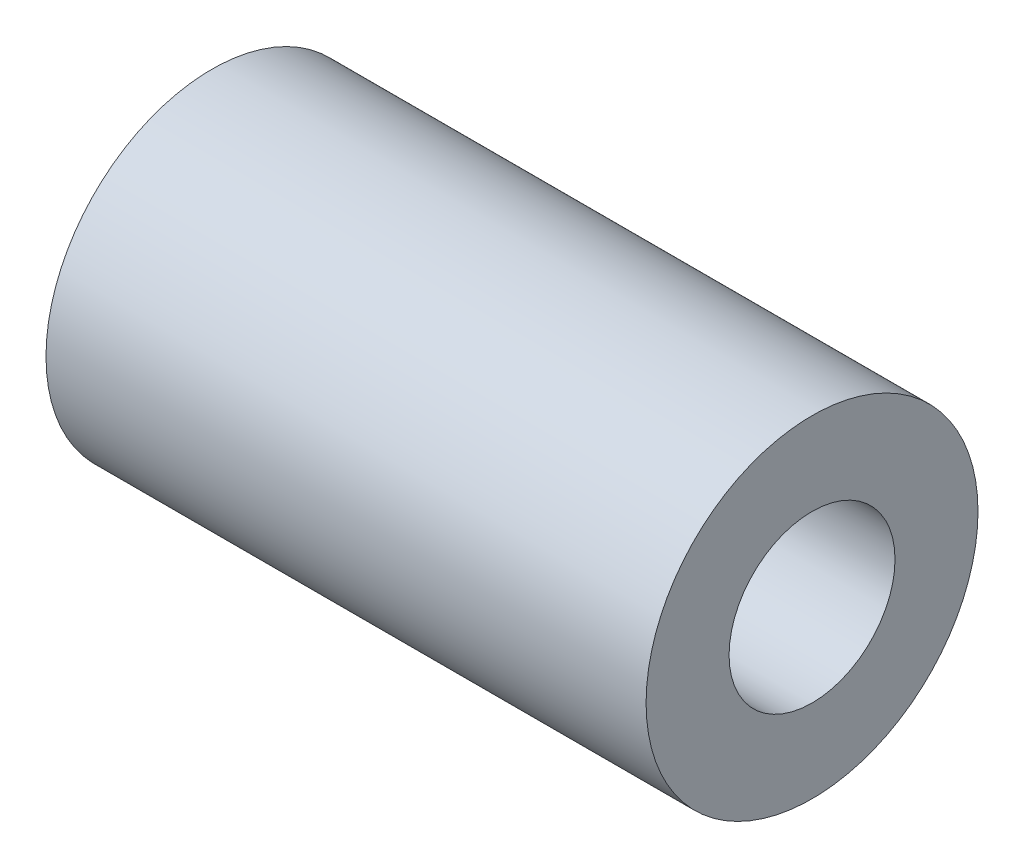
ISO-10303-21;
HEADER;
FILE_DESCRIPTION(('STEP AP214'),'2;1');
FILE_NAME('part.step','',(''),(''),'','','');
FILE_SCHEMA(('AUTOMOTIVE_DESIGN { 1 0 10303 214 1 1 1 1 }'));
ENDSEC;
DATA;
#1=APPLICATION_CONTEXT('core data for automotive mechanical design processes');
#2=APPLICATION_PROTOCOL_DEFINITION('international standard','automotive_design',2000,#1);
#3=PRODUCT_CONTEXT('',#1,'mechanical');
#4=PRODUCT('Part','Part','',(#3));
#5=PRODUCT_RELATED_PRODUCT_CATEGORY('part','',(#4));
#6=PRODUCT_DEFINITION_FORMATION('','',#4);
#7=PRODUCT_DEFINITION_CONTEXT('part definition',#1,'design');
#8=PRODUCT_DEFINITION('design','',#6,#7);
#9=PRODUCT_DEFINITION_SHAPE('','',#8);
#10=(LENGTH_UNIT() NAMED_UNIT(*) SI_UNIT(.MILLI.,.METRE.));
#11=(NAMED_UNIT(*) PLANE_ANGLE_UNIT() SI_UNIT($,.RADIAN.));
#12=(NAMED_UNIT(*) SI_UNIT($,.STERADIAN.) SOLID_ANGLE_UNIT());
#13=UNCERTAINTY_MEASURE_WITH_UNIT(LENGTH_MEASURE(1.E-05),#10,'distance_accuracy_value','');
#14=(GEOMETRIC_REPRESENTATION_CONTEXT(3) GLOBAL_UNCERTAINTY_ASSIGNED_CONTEXT((#13)) GLOBAL_UNIT_ASSIGNED_CONTEXT((#10,
#11,#12)) REPRESENTATION_CONTEXT('',''));
#15=CARTESIAN_POINT('',(0.,0.,0.));
#16=DIRECTION('',(0.,0.,1.));
#17=DIRECTION('',(1.,0.,0.));
#18=AXIS2_PLACEMENT_3D('',#15,#16,#17);
#19=CARTESIAN_POINT('',(9.84,0.,0.));
#20=DIRECTION('',(1.,0.,0.));
#21=DIRECTION('',(0.,0.,-1.));
#22=AXIS2_PLACEMENT_3D('',#19,#20,#21);
#23=CYLINDRICAL_SURFACE('',#22,2.5);
#24=CARTESIAN_POINT('',(0.8,0.,0.));
#25=DIRECTION('',(1.,0.,0.));
#26=DIRECTION('',(0.,0.,-1.));
#27=AXIS2_PLACEMENT_3D('',#24,#25,#26);
#28=CIRCLE('',#27,2.5);
#29=CARTESIAN_POINT('',(0.8,0.,-2.5));
#30=VERTEX_POINT('',#29);
#31=EDGE_CURVE('E18',#30,#30,#28,.T.);
#32=ORIENTED_EDGE('',*,*,#31,.F.);
#33=EDGE_LOOP('',(#32));
#34=FACE_BOUND('',#33,.T.);
#35=CARTESIAN_POINT('',(18.88,0.,0.));
#36=DIRECTION('',(1.,0.,0.));
#37=DIRECTION('',(0.,0.,-1.));
#38=AXIS2_PLACEMENT_3D('',#35,#36,#37);
#39=CIRCLE('',#38,2.5);
#40=CARTESIAN_POINT('',(18.88,0.,-2.5));
#41=VERTEX_POINT('',#40);
#42=EDGE_CURVE('E27',#41,#41,#39,.F.);
#43=ORIENTED_EDGE('',*,*,#42,.F.);
#44=EDGE_LOOP('',(#43));
#45=FACE_BOUND('',#44,.T.);
#46=ADVANCED_FACE('F15',(#34,#45),#23,.F.);
#47=CARTESIAN_POINT('',(0.8,0.,3.75));
#48=DIRECTION('',(-1.,0.,0.));
#49=DIRECTION('',(0.,0.,1.));
#50=AXIS2_PLACEMENT_3D('',#47,#48,#49);
#51=PLANE('',#50);
#52=ORIENTED_EDGE('',*,*,#31,.T.);
#53=EDGE_LOOP('',(#52));
#54=FACE_BOUND('',#53,.T.);
#55=CARTESIAN_POINT('',(0.8,0.,0.));
#56=DIRECTION('',(1.,0.,0.));
#57=DIRECTION('',(0.,0.,-1.));
#58=AXIS2_PLACEMENT_3D('',#55,#56,#57);
#59=CIRCLE('',#58,5.);
#60=CARTESIAN_POINT('',(0.8,0.,-5.));
#61=VERTEX_POINT('',#60);
#62=EDGE_CURVE('E22',#61,#61,#59,.T.);
#63=ORIENTED_EDGE('',*,*,#62,.F.);
#64=EDGE_LOOP('',(#63));
#65=FACE_BOUND('',#64,.T.);
#66=ADVANCED_FACE('F35',(#54,#65),#51,.T.);
#67=CARTESIAN_POINT('',(18.88,0.,3.75));
#68=DIRECTION('',(1.,0.,0.));
#69=DIRECTION('',(0.,0.,-1.));
#70=AXIS2_PLACEMENT_3D('',#67,#68,#69);
#71=PLANE('',#70);
#72=CARTESIAN_POINT('',(18.88,0.,0.));
#73=DIRECTION('',(1.,0.,0.));
#74=DIRECTION('',(0.,0.,-1.));
#75=AXIS2_PLACEMENT_3D('',#72,#73,#74);
#76=CIRCLE('',#75,5.);
#77=CARTESIAN_POINT('',(18.88,0.,-5.));
#78=VERTEX_POINT('',#77);
#79=EDGE_CURVE('E10',#78,#78,#76,.F.);
#80=ORIENTED_EDGE('',*,*,#79,.F.);
#81=EDGE_LOOP('',(#80));
#82=FACE_BOUND('',#81,.T.);
#83=ORIENTED_EDGE('',*,*,#42,.T.);
#84=EDGE_LOOP('',(#83));
#85=FACE_BOUND('',#84,.T.);
#86=ADVANCED_FACE('F44',(#82,#85),#71,.T.);
#87=CARTESIAN_POINT('',(9.84,0.,0.));
#88=DIRECTION('',(1.,0.,0.));
#89=DIRECTION('',(0.,0.,-1.));
#90=AXIS2_PLACEMENT_3D('',#87,#88,#89);
#91=CYLINDRICAL_SURFACE('',#90,5.);
#92=ORIENTED_EDGE('',*,*,#62,.T.);
#93=EDGE_LOOP('',(#92));
#94=FACE_BOUND('',#93,.T.);
#95=ORIENTED_EDGE('',*,*,#79,.T.);
#96=EDGE_LOOP('',(#95));
#97=FACE_BOUND('',#96,.T.);
#98=ADVANCED_FACE('F45',(#94,#97),#91,.T.);
#99=CLOSED_SHELL('',(#46,#66,#86,#98));
#100=MANIFOLD_SOLID_BREP('B1',#99);
#101=ADVANCED_BREP_SHAPE_REPRESENTATION('',(#18,#100),#14);
#102=SHAPE_DEFINITION_REPRESENTATION(#9,#101);
ENDSEC;
END-ISO-10303-21;
